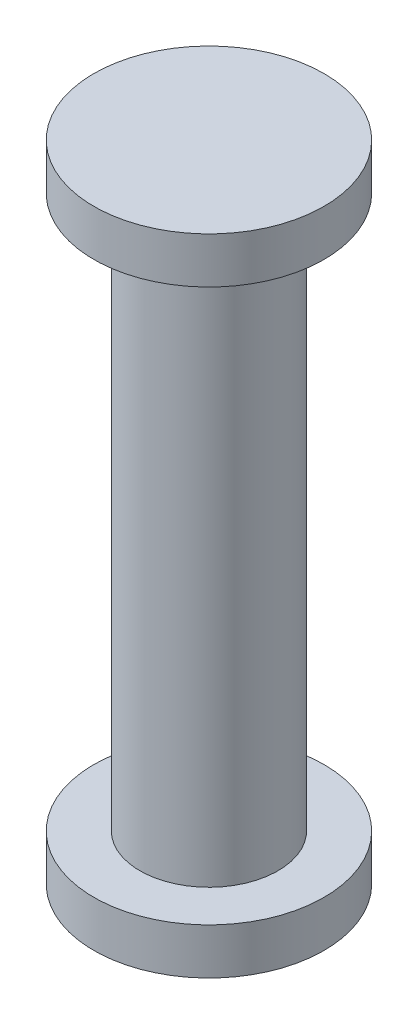
ISO-10303-21;
HEADER;
FILE_DESCRIPTION(('STEP AP214'),'2;1');
FILE_NAME('part.step','',(''),(''),'','','');
FILE_SCHEMA(('AUTOMOTIVE_DESIGN { 1 0 10303 214 1 1 1 1 }'));
ENDSEC;
DATA;
#1=APPLICATION_CONTEXT('core data for automotive mechanical design processes');
#2=APPLICATION_PROTOCOL_DEFINITION('international standard','automotive_design',2000,#1);
#3=PRODUCT_CONTEXT('',#1,'mechanical');
#4=PRODUCT('Part','Part','',(#3));
#5=PRODUCT_RELATED_PRODUCT_CATEGORY('part','',(#4));
#6=PRODUCT_DEFINITION_FORMATION('','',#4);
#7=PRODUCT_DEFINITION_CONTEXT('part definition',#1,'design');
#8=PRODUCT_DEFINITION('design','',#6,#7);
#9=PRODUCT_DEFINITION_SHAPE('','',#8);
#10=(LENGTH_UNIT() NAMED_UNIT(*) SI_UNIT(.MILLI.,.METRE.));
#11=(NAMED_UNIT(*) PLANE_ANGLE_UNIT() SI_UNIT($,.RADIAN.));
#12=(NAMED_UNIT(*) SI_UNIT($,.STERADIAN.) SOLID_ANGLE_UNIT());
#13=UNCERTAINTY_MEASURE_WITH_UNIT(LENGTH_MEASURE(1.E-05),#10,'distance_accuracy_value','');
#14=(GEOMETRIC_REPRESENTATION_CONTEXT(3) GLOBAL_UNCERTAINTY_ASSIGNED_CONTEXT((#13)) GLOBAL_UNIT_ASSIGNED_CONTEXT((#10,
#11,#12)) REPRESENTATION_CONTEXT('',''));
#15=CARTESIAN_POINT('',(0.,0.,0.));
#16=DIRECTION('',(0.,0.,1.));
#17=DIRECTION('',(1.,0.,0.));
#18=AXIS2_PLACEMENT_3D('',#15,#16,#17);
#19=CARTESIAN_POINT('',(-2.5,0.,0.));
#20=DIRECTION('',(0.,1.,0.));
#21=DIRECTION('',(0.,0.,1.));
#22=AXIS2_PLACEMENT_3D('',#19,#20,#21);
#23=PLANE('',#22);
#24=CARTESIAN_POINT('',(0.,0.,0.));
#25=DIRECTION('',(0.,-1.,0.));
#26=DIRECTION('',(0.,0.,-1.));
#27=AXIS2_PLACEMENT_3D('',#24,#25,#26);
#28=CIRCLE('',#27,2.5);
#29=CARTESIAN_POINT('',(0.,0.,-2.5));
#30=VERTEX_POINT('',#29);
#31=EDGE_CURVE('E56',#30,#30,#28,.T.);
#32=ORIENTED_EDGE('',*,*,#31,.T.);
#33=EDGE_LOOP('',(#32));
#34=FACE_BOUND('',#33,.T.);
#35=ADVANCED_FACE('F34',(#34),#23,.F.);
#36=CARTESIAN_POINT('',(-2.08169899802733,14.,0.));
#37=DIRECTION('',(0.,-1.,0.));
#38=DIRECTION('',(0.,0.,-1.));
#39=AXIS2_PLACEMENT_3D('',#36,#37,#38);
#40=PLANE('',#39);
#41=CARTESIAN_POINT('',(0.,14.,0.));
#42=DIRECTION('',(0.,-1.,0.));
#43=DIRECTION('',(0.,0.,-1.));
#44=AXIS2_PLACEMENT_3D('',#41,#42,#43);
#45=CIRCLE('',#44,2.5);
#46=CARTESIAN_POINT('',(0.,14.,-2.5));
#47=VERTEX_POINT('',#46);
#48=EDGE_CURVE('E10',#47,#47,#45,.T.);
#49=ORIENTED_EDGE('',*,*,#48,.F.);
#50=EDGE_LOOP('',(#49));
#51=FACE_BOUND('',#50,.T.);
#52=ADVANCED_FACE('F86',(#51),#40,.F.);
#53=CARTESIAN_POINT('',(0.,0.,0.));
#54=DIRECTION('',(0.,-1.,0.));
#55=DIRECTION('',(0.,0.,-1.));
#56=AXIS2_PLACEMENT_3D('',#53,#54,#55);
#57=CYLINDRICAL_SURFACE('',#56,2.5);
#58=CARTESIAN_POINT('',(0.,13.,0.));
#59=DIRECTION('',(0.,-1.,0.));
#60=DIRECTION('',(0.,0.,-1.));
#61=AXIS2_PLACEMENT_3D('',#58,#59,#60);
#62=CIRCLE('',#61,2.5);
#63=CARTESIAN_POINT('',(0.,13.,-2.5));
#64=VERTEX_POINT('',#63);
#65=EDGE_CURVE('E40',#64,#64,#62,.T.);
#66=ORIENTED_EDGE('',*,*,#65,.F.);
#67=EDGE_LOOP('',(#66));
#68=FACE_BOUND('',#67,.T.);
#69=ORIENTED_EDGE('',*,*,#48,.T.);
#70=EDGE_LOOP('',(#69));
#71=FACE_BOUND('',#70,.T.);
#72=ADVANCED_FACE('F81',(#68,#71),#57,.T.);
#73=CARTESIAN_POINT('',(-2.5,13.,0.));
#74=DIRECTION('',(0.,1.,0.));
#75=DIRECTION('',(0.,0.,1.));
#76=AXIS2_PLACEMENT_3D('',#73,#74,#75);
#77=PLANE('',#76);
#78=CARTESIAN_POINT('',(0.,13.,0.));
#79=DIRECTION('',(0.,-1.,0.));
#80=DIRECTION('',(0.,0.,-1.));
#81=AXIS2_PLACEMENT_3D('',#78,#79,#80);
#82=CIRCLE('',#81,1.5);
#83=CARTESIAN_POINT('',(0.,13.,-1.5));
#84=VERTEX_POINT('',#83);
#85=EDGE_CURVE('E44',#84,#84,#82,.T.);
#86=ORIENTED_EDGE('',*,*,#85,.F.);
#87=EDGE_LOOP('',(#86));
#88=FACE_BOUND('',#87,.T.);
#89=ORIENTED_EDGE('',*,*,#65,.T.);
#90=EDGE_LOOP('',(#89));
#91=FACE_BOUND('',#90,.T.);
#92=ADVANCED_FACE('F76',(#88,#91),#77,.F.);
#93=CARTESIAN_POINT('',(0.,0.,0.));
#94=DIRECTION('',(0.,-1.,0.));
#95=DIRECTION('',(0.,0.,-1.));
#96=AXIS2_PLACEMENT_3D('',#93,#94,#95);
#97=CYLINDRICAL_SURFACE('',#96,1.5);
#98=CARTESIAN_POINT('',(0.,1.,0.));
#99=DIRECTION('',(0.,-1.,0.));
#100=DIRECTION('',(0.,0.,-1.));
#101=AXIS2_PLACEMENT_3D('',#98,#99,#100);
#102=CIRCLE('',#101,1.5);
#103=CARTESIAN_POINT('',(0.,1.,-1.5));
#104=VERTEX_POINT('',#103);
#105=EDGE_CURVE('E48',#104,#104,#102,.T.);
#106=ORIENTED_EDGE('',*,*,#105,.F.);
#107=EDGE_LOOP('',(#106));
#108=FACE_BOUND('',#107,.T.);
#109=ORIENTED_EDGE('',*,*,#85,.T.);
#110=EDGE_LOOP('',(#109));
#111=FACE_BOUND('',#110,.T.);
#112=ADVANCED_FACE('F70',(#108,#111),#97,.T.);
#113=CARTESIAN_POINT('',(-1.5,1.,0.));
#114=DIRECTION('',(0.,-1.,0.));
#115=DIRECTION('',(0.,0.,-1.));
#116=AXIS2_PLACEMENT_3D('',#113,#114,#115);
#117=PLANE('',#116);
#118=CARTESIAN_POINT('',(0.,1.,0.));
#119=DIRECTION('',(0.,-1.,0.));
#120=DIRECTION('',(0.,0.,-1.));
#121=AXIS2_PLACEMENT_3D('',#118,#119,#120);
#122=CIRCLE('',#121,2.5);
#123=CARTESIAN_POINT('',(0.,1.,-2.5));
#124=VERTEX_POINT('',#123);
#125=EDGE_CURVE('E53',#124,#124,#122,.T.);
#126=ORIENTED_EDGE('',*,*,#125,.F.);
#127=EDGE_LOOP('',(#126));
#128=FACE_BOUND('',#127,.T.);
#129=ORIENTED_EDGE('',*,*,#105,.T.);
#130=EDGE_LOOP('',(#129));
#131=FACE_BOUND('',#130,.T.);
#132=ADVANCED_FACE('F64',(#128,#131),#117,.F.);
#133=CARTESIAN_POINT('',(0.,0.,0.));
#134=DIRECTION('',(0.,-1.,0.));
#135=DIRECTION('',(0.,0.,-1.));
#136=AXIS2_PLACEMENT_3D('',#133,#134,#135);
#137=CYLINDRICAL_SURFACE('',#136,2.5);
#138=ORIENTED_EDGE('',*,*,#31,.F.);
#139=EDGE_LOOP('',(#138));
#140=FACE_BOUND('',#139,.T.);
#141=ORIENTED_EDGE('',*,*,#125,.T.);
#142=EDGE_LOOP('',(#141));
#143=FACE_BOUND('',#142,.T.);
#144=ADVANCED_FACE('F61',(#140,#143),#137,.T.);
#145=CLOSED_SHELL('',(#35,#52,#72,#92,#112,#132,#144));
#146=MANIFOLD_SOLID_BREP('B2',#145);
#147=ADVANCED_BREP_SHAPE_REPRESENTATION('',(#18,#146),#14);
#148=SHAPE_DEFINITION_REPRESENTATION(#9,#147);
ENDSEC;
END-ISO-10303-21;
